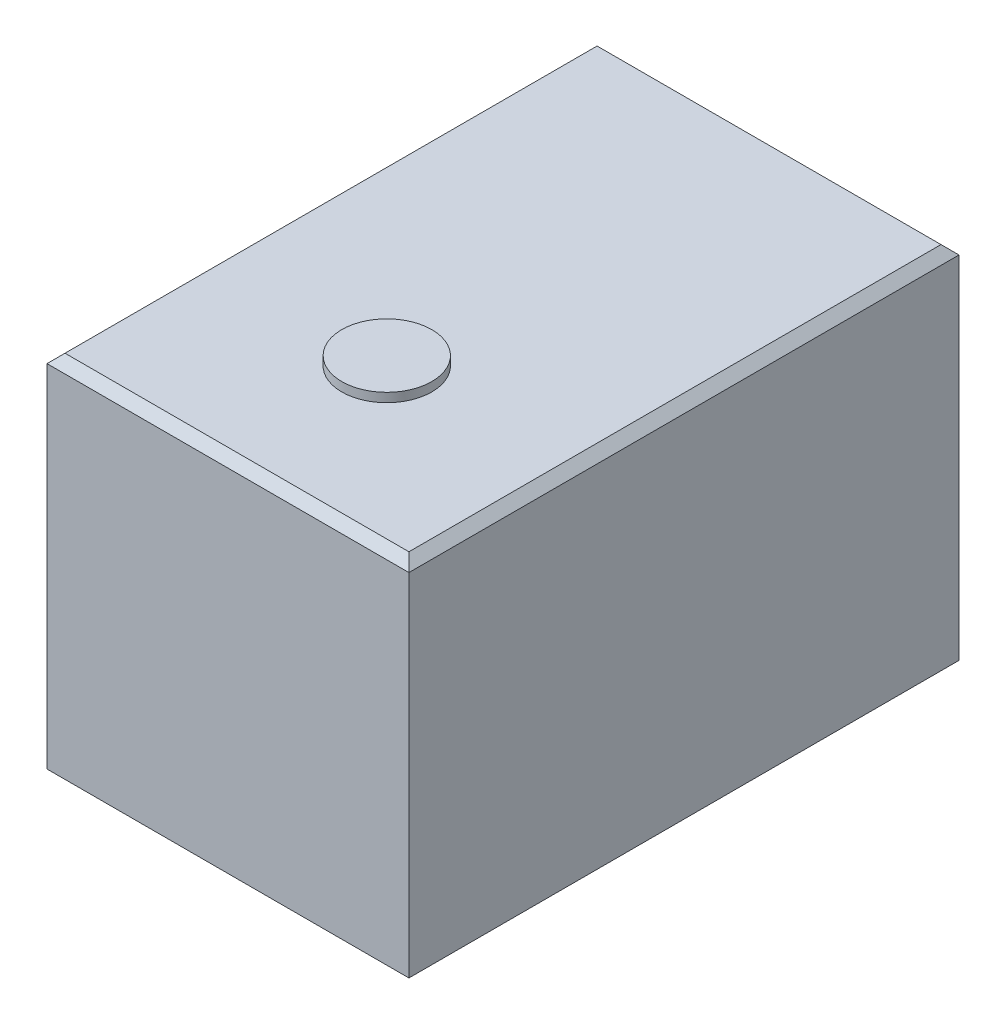
ISO-10303-21;
HEADER;
FILE_DESCRIPTION(('STEP AP214'),'2;1');
FILE_NAME('part.step','',(''),(''),'','','');
FILE_SCHEMA(('AUTOMOTIVE_DESIGN { 1 0 10303 214 1 1 1 1 }'));
ENDSEC;
DATA;
#1=APPLICATION_CONTEXT('core data for automotive mechanical design processes');
#2=APPLICATION_PROTOCOL_DEFINITION('international standard','automotive_design',2000,#1);
#3=PRODUCT_CONTEXT('',#1,'mechanical');
#4=PRODUCT('Part','Part','',(#3));
#5=PRODUCT_RELATED_PRODUCT_CATEGORY('part','',(#4));
#6=PRODUCT_DEFINITION_FORMATION('','',#4);
#7=PRODUCT_DEFINITION_CONTEXT('part definition',#1,'design');
#8=PRODUCT_DEFINITION('design','',#6,#7);
#9=PRODUCT_DEFINITION_SHAPE('','',#8);
#10=(LENGTH_UNIT() NAMED_UNIT(*) SI_UNIT(.MILLI.,.METRE.));
#11=(NAMED_UNIT(*) PLANE_ANGLE_UNIT() SI_UNIT($,.RADIAN.));
#12=(NAMED_UNIT(*) SI_UNIT($,.STERADIAN.) SOLID_ANGLE_UNIT());
#13=UNCERTAINTY_MEASURE_WITH_UNIT(LENGTH_MEASURE(1.E-05),#10,'distance_accuracy_value','');
#14=(GEOMETRIC_REPRESENTATION_CONTEXT(3) GLOBAL_UNCERTAINTY_ASSIGNED_CONTEXT((#13)) GLOBAL_UNIT_ASSIGNED_CONTEXT((#10,
#11,#12)) REPRESENTATION_CONTEXT('',''));
#15=CARTESIAN_POINT('',(0.,0.,0.));
#16=DIRECTION('',(0.,0.,1.));
#17=DIRECTION('',(1.,0.,0.));
#18=AXIS2_PLACEMENT_3D('',#15,#16,#17);
#19=CARTESIAN_POINT('',(0.,41.,-61.1));
#20=DIRECTION('',(1.,0.,0.));
#21=DIRECTION('',(0.,0.,-1.));
#22=AXIS2_PLACEMENT_3D('',#19,#20,#21);
#23=PLANE('',#22);
#24=DIRECTION('',(0.,-1.,0.));
#25=VECTOR('',#24,1.);
#26=CARTESIAN_POINT('',(0.,41.,-61.1));
#27=LINE('',#26,#25);
#28=CARTESIAN_POINT('',(0.,40.,-61.1));
#29=VERTEX_POINT('',#28);
#30=CARTESIAN_POINT('',(0.,1.00000000000001,-61.1));
#31=VERTEX_POINT('',#30);
#32=EDGE_CURVE('E154',#29,#31,#27,.T.);
#33=ORIENTED_EDGE('',*,*,#32,.T.);
#34=DIRECTION('',(0.,0.,1.));
#35=VECTOR('',#34,1.);
#36=CARTESIAN_POINT('',(0.,1.00000000000001,-61.1));
#37=LINE('',#36,#35);
#38=CARTESIAN_POINT('',(0.,1.00000000000001,0.));
#39=VERTEX_POINT('',#38);
#40=EDGE_CURVE('E168',#31,#39,#37,.T.);
#41=ORIENTED_EDGE('',*,*,#40,.T.);
#42=DIRECTION('',(0.,-1.,0.));
#43=VECTOR('',#42,1.);
#44=CARTESIAN_POINT('',(0.,41.,0.));
#45=LINE('',#44,#43);
#46=CARTESIAN_POINT('',(0.,40.,0.));
#47=VERTEX_POINT('',#46);
#48=EDGE_CURVE('E131',#47,#39,#45,.T.);
#49=ORIENTED_EDGE('',*,*,#48,.F.);
#50=DIRECTION('',(0.,0.,-1.));
#51=VECTOR('',#50,1.);
#52=CARTESIAN_POINT('',(0.,40.,-61.1));
#53=LINE('',#52,#51);
#54=EDGE_CURVE('E146',#47,#29,#53,.T.);
#55=ORIENTED_EDGE('',*,*,#54,.T.);
#56=EDGE_LOOP('',(#33,#41,#49,#55));
#57=FACE_BOUND('',#56,.T.);
#58=ADVANCED_FACE('F41',(#57),#23,.F.);
#59=CARTESIAN_POINT('',(0.,41.,0.));
#60=DIRECTION('',(0.,0.,-1.));
#61=DIRECTION('',(-1.,0.,0.));
#62=AXIS2_PLACEMENT_3D('',#59,#60,#61);
#63=PLANE('',#62);
#64=ORIENTED_EDGE('',*,*,#48,.T.);
#65=DIRECTION('',(1.,0.,0.));
#66=VECTOR('',#65,1.);
#67=CARTESIAN_POINT('',(0.,1.00000000000001,0.));
#68=LINE('',#67,#66);
#69=CARTESIAN_POINT('',(40.2,1.00000000000001,0.));
#70=VERTEX_POINT('',#69);
#71=EDGE_CURVE('E147',#39,#70,#68,.T.);
#72=ORIENTED_EDGE('',*,*,#71,.T.);
#73=DIRECTION('',(0.,-1.,0.));
#74=VECTOR('',#73,1.);
#75=CARTESIAN_POINT('',(40.2,41.,0.));
#76=LINE('',#75,#74);
#77=CARTESIAN_POINT('',(40.2,40.,0.));
#78=VERTEX_POINT('',#77);
#79=EDGE_CURVE('E205',#78,#70,#76,.T.);
#80=ORIENTED_EDGE('',*,*,#79,.F.);
#81=DIRECTION('',(-1.,0.,0.));
#82=VECTOR('',#81,1.);
#83=CARTESIAN_POINT('',(0.,40.,0.));
#84=LINE('',#83,#82);
#85=EDGE_CURVE('E144',#78,#47,#84,.T.);
#86=ORIENTED_EDGE('',*,*,#85,.T.);
#87=EDGE_LOOP('',(#64,#72,#80,#86));
#88=FACE_BOUND('',#87,.T.);
#89=ADVANCED_FACE('F204',(#88),#63,.F.);
#90=CARTESIAN_POINT('',(40.2,41.,0.));
#91=DIRECTION('',(-1.,0.,0.));
#92=DIRECTION('',(0.,0.,1.));
#93=AXIS2_PLACEMENT_3D('',#90,#91,#92);
#94=PLANE('',#93);
#95=ORIENTED_EDGE('',*,*,#79,.T.);
#96=DIRECTION('',(0.,0.,-1.));
#97=VECTOR('',#96,1.);
#98=CARTESIAN_POINT('',(40.2,1.00000000000001,0.));
#99=LINE('',#98,#97);
#100=CARTESIAN_POINT('',(40.2,1.00000000000001,-61.1));
#101=VERTEX_POINT('',#100);
#102=EDGE_CURVE('E65',#70,#101,#99,.T.);
#103=ORIENTED_EDGE('',*,*,#102,.T.);
#104=DIRECTION('',(0.,-1.,0.));
#105=VECTOR('',#104,1.);
#106=CARTESIAN_POINT('',(40.2,41.,-61.1));
#107=LINE('',#106,#105);
#108=CARTESIAN_POINT('',(40.2,40.,-61.1));
#109=VERTEX_POINT('',#108);
#110=EDGE_CURVE('E210',#109,#101,#107,.T.);
#111=ORIENTED_EDGE('',*,*,#110,.F.);
#112=DIRECTION('',(0.,0.,1.));
#113=VECTOR('',#112,1.);
#114=CARTESIAN_POINT('',(40.2,40.,0.));
#115=LINE('',#114,#113);
#116=EDGE_CURVE('E138',#109,#78,#115,.T.);
#117=ORIENTED_EDGE('',*,*,#116,.T.);
#118=EDGE_LOOP('',(#95,#103,#111,#117));
#119=FACE_BOUND('',#118,.T.);
#120=ADVANCED_FACE('F208',(#119),#94,.F.);
#121=CARTESIAN_POINT('',(40.2,41.,-61.1));
#122=DIRECTION('',(0.,0.,1.));
#123=DIRECTION('',(1.,0.,0.));
#124=AXIS2_PLACEMENT_3D('',#121,#122,#123);
#125=PLANE('',#124);
#126=ORIENTED_EDGE('',*,*,#110,.T.);
#127=DIRECTION('',(-1.,0.,0.));
#128=VECTOR('',#127,1.);
#129=CARTESIAN_POINT('',(40.2,1.00000000000001,-61.1));
#130=LINE('',#129,#128);
#131=EDGE_CURVE('E57',#101,#31,#130,.T.);
#132=ORIENTED_EDGE('',*,*,#131,.T.);
#133=ORIENTED_EDGE('',*,*,#32,.F.);
#134=DIRECTION('',(1.,0.,0.));
#135=VECTOR('',#134,1.);
#136=CARTESIAN_POINT('',(40.2,40.,-61.1));
#137=LINE('',#136,#135);
#138=EDGE_CURVE('E117',#29,#109,#137,.T.);
#139=ORIENTED_EDGE('',*,*,#138,.T.);
#140=EDGE_LOOP('',(#126,#132,#133,#139));
#141=FACE_BOUND('',#140,.T.);
#142=ADVANCED_FACE('F219',(#141),#125,.F.);
#143=CARTESIAN_POINT('',(0.,41.,0.));
#144=DIRECTION('',(0.,1.,0.));
#145=DIRECTION('',(0.,0.,1.));
#146=AXIS2_PLACEMENT_3D('',#143,#144,#145);
#147=PLANE('',#146);
#148=CARTESIAN_POINT('',(20.1,41.,-17.6409726784528));
#149=DIRECTION('',(0.,1.,0.));
#150=DIRECTION('',(0.,0.,1.));
#151=AXIS2_PLACEMENT_3D('',#148,#149,#150);
#152=CIRCLE('',#151,5.);
#153=CARTESIAN_POINT('',(20.1,41.,-12.6409726784528));
#154=VERTEX_POINT('',#153);
#155=EDGE_CURVE('E11',#154,#154,#152,.T.);
#156=ORIENTED_EDGE('',*,*,#155,.F.);
#157=EDGE_LOOP('',(#156));
#158=FACE_BOUND('',#157,.T.);
#159=DIRECTION('',(0.,0.,-1.));
#160=VECTOR('',#159,1.);
#161=CARTESIAN_POINT('',(39.2,41.,-61.1));
#162=LINE('',#161,#160);
#163=CARTESIAN_POINT('',(39.2,41.,-1.00000000000001));
#164=VERTEX_POINT('',#163);
#165=CARTESIAN_POINT('',(39.2,41.,-60.1));
#166=VERTEX_POINT('',#165);
#167=EDGE_CURVE('E135',#164,#166,#162,.T.);
#168=ORIENTED_EDGE('',*,*,#167,.T.);
#169=DIRECTION('',(-1.,0.,0.));
#170=VECTOR('',#169,1.);
#171=CARTESIAN_POINT('',(0.,41.,-60.1));
#172=LINE('',#171,#170);
#173=CARTESIAN_POINT('',(1.00000000000001,41.,-60.1));
#174=VERTEX_POINT('',#173);
#175=EDGE_CURVE('E115',#166,#174,#172,.T.);
#176=ORIENTED_EDGE('',*,*,#175,.T.);
#177=DIRECTION('',(0.,0.,1.));
#178=VECTOR('',#177,1.);
#179=CARTESIAN_POINT('',(1.00000000000001,41.,0.));
#180=LINE('',#179,#178);
#181=CARTESIAN_POINT('',(1.00000000000001,41.,-1.00000000000001));
#182=VERTEX_POINT('',#181);
#183=EDGE_CURVE('E124',#174,#182,#180,.T.);
#184=ORIENTED_EDGE('',*,*,#183,.T.);
#185=DIRECTION('',(1.,0.,0.));
#186=VECTOR('',#185,1.);
#187=CARTESIAN_POINT('',(40.2,41.,-1.00000000000001));
#188=LINE('',#187,#186);
#189=EDGE_CURVE('E130',#182,#164,#188,.T.);
#190=ORIENTED_EDGE('',*,*,#189,.T.);
#191=EDGE_LOOP('',(#168,#176,#184,#190));
#192=FACE_BOUND('',#191,.T.);
#193=ADVANCED_FACE('F133',(#158,#192),#147,.T.);
#194=CARTESIAN_POINT('',(0.,0.,0.));
#195=DIRECTION('',(0.,1.,0.));
#196=DIRECTION('',(0.,0.,1.));
#197=AXIS2_PLACEMENT_3D('',#194,#195,#196);
#198=PLANE('',#197);
#199=CARTESIAN_POINT('',(20.1,0.,-17.6409726784528));
#200=DIRECTION('',(0.,1.,0.));
#201=DIRECTION('',(0.,0.,1.));
#202=AXIS2_PLACEMENT_3D('',#199,#200,#201);
#203=CIRCLE('',#202,5.);
#204=CARTESIAN_POINT('',(20.1,0.,-12.6409726784528));
#205=VERTEX_POINT('',#204);
#206=EDGE_CURVE('E50',#205,#205,#203,.F.);
#207=ORIENTED_EDGE('',*,*,#206,.F.);
#208=EDGE_LOOP('',(#207));
#209=FACE_BOUND('',#208,.T.);
#210=DIRECTION('',(0.,0.,1.));
#211=VECTOR('',#210,1.);
#212=CARTESIAN_POINT('',(39.2,0.,0.));
#213=LINE('',#212,#211);
#214=CARTESIAN_POINT('',(39.2,0.,-60.1));
#215=VERTEX_POINT('',#214);
#216=CARTESIAN_POINT('',(39.2,0.,-1.00000000000001));
#217=VERTEX_POINT('',#216);
#218=EDGE_CURVE('E161',#215,#217,#213,.T.);
#219=ORIENTED_EDGE('',*,*,#218,.T.);
#220=DIRECTION('',(-1.,0.,0.));
#221=VECTOR('',#220,1.);
#222=CARTESIAN_POINT('',(0.,0.,-1.00000000000001));
#223=LINE('',#222,#221);
#224=CARTESIAN_POINT('',(1.00000000000001,0.,-1.00000000000001));
#225=VERTEX_POINT('',#224);
#226=EDGE_CURVE('E163',#217,#225,#223,.T.);
#227=ORIENTED_EDGE('',*,*,#226,.T.);
#228=DIRECTION('',(0.,0.,-1.));
#229=VECTOR('',#228,1.);
#230=CARTESIAN_POINT('',(1.00000000000001,0.,0.));
#231=LINE('',#230,#229);
#232=CARTESIAN_POINT('',(1.00000000000001,0.,-60.1));
#233=VERTEX_POINT('',#232);
#234=EDGE_CURVE('E157',#225,#233,#231,.T.);
#235=ORIENTED_EDGE('',*,*,#234,.T.);
#236=DIRECTION('',(1.,0.,0.));
#237=VECTOR('',#236,1.);
#238=CARTESIAN_POINT('',(0.,0.,-60.1));
#239=LINE('',#238,#237);
#240=EDGE_CURVE('E159',#233,#215,#239,.T.);
#241=ORIENTED_EDGE('',*,*,#240,.T.);
#242=EDGE_LOOP('',(#219,#227,#235,#241));
#243=FACE_BOUND('',#242,.T.);
#244=ADVANCED_FACE('F184',(#209,#243),#198,.F.);
#245=CARTESIAN_POINT('',(0.,41.,-1.00000000000001));
#246=DIRECTION('',(0.,0.707106781186547,0.707106781186547));
#247=DIRECTION('',(-1.,0.,0.));
#248=AXIS2_PLACEMENT_3D('',#245,#246,#247);
#249=PLANE('',#248);
#250=DIRECTION('',(0.577350269189626,0.577350269189626,-0.577350269189626));
#251=VECTOR('',#250,1.);
#252=CARTESIAN_POINT('',(0.666666666666672,40.6666666666667,-0.666666666666672));
#253=LINE('',#252,#251);
#254=EDGE_CURVE('E127',#47,#182,#253,.T.);
#255=ORIENTED_EDGE('',*,*,#254,.F.);
#256=ORIENTED_EDGE('',*,*,#85,.F.);
#257=DIRECTION('',(-0.577350269189626,0.577350269189626,-0.577350269189626));
#258=VECTOR('',#257,1.);
#259=CARTESIAN_POINT('',(26.1333333333333,54.0666666666667,-14.0666666666667));
#260=LINE('',#259,#258);
#261=EDGE_CURVE('E151',#164,#78,#260,.F.);
#262=ORIENTED_EDGE('',*,*,#261,.F.);
#263=ORIENTED_EDGE('',*,*,#189,.F.);
#264=EDGE_LOOP('',(#255,#256,#262,#263));
#265=FACE_BOUND('',#264,.T.);
#266=ADVANCED_FACE('F187',(#265),#249,.T.);
#267=CARTESIAN_POINT('',(39.2,41.,0.));
#268=DIRECTION('',(0.707106781186547,0.707106781186547,0.));
#269=DIRECTION('',(0.,0.,1.));
#270=AXIS2_PLACEMENT_3D('',#267,#268,#269);
#271=PLANE('',#270);
#272=ORIENTED_EDGE('',*,*,#261,.T.);
#273=ORIENTED_EDGE('',*,*,#116,.F.);
#274=DIRECTION('',(-0.577350269189626,0.577350269189626,0.577350269189626));
#275=VECTOR('',#274,1.);
#276=CARTESIAN_POINT('',(19.1666666666667,61.0333333333333,-40.0666666666667));
#277=LINE('',#276,#275);
#278=EDGE_CURVE('E120',#166,#109,#277,.F.);
#279=ORIENTED_EDGE('',*,*,#278,.F.);
#280=ORIENTED_EDGE('',*,*,#167,.F.);
#281=EDGE_LOOP('',(#272,#273,#279,#280));
#282=FACE_BOUND('',#281,.T.);
#283=ADVANCED_FACE('F218',(#282),#271,.T.);
#284=CARTESIAN_POINT('',(1.00000000000001,41.,0.));
#285=DIRECTION('',(-0.707106781186547,0.707106781186547,0.));
#286=DIRECTION('',(0.,0.,-1.));
#287=AXIS2_PLACEMENT_3D('',#284,#285,#286);
#288=PLANE('',#287);
#289=ORIENTED_EDGE('',*,*,#254,.T.);
#290=ORIENTED_EDGE('',*,*,#183,.F.);
#291=DIRECTION('',(-0.577350269189626,-0.577350269189626,-0.577350269189626));
#292=VECTOR('',#291,1.);
#293=CARTESIAN_POINT('',(21.0333333333333,61.0333333333333,-40.0666666666667));
#294=LINE('',#293,#292);
#295=EDGE_CURVE('E111',#29,#174,#294,.F.);
#296=ORIENTED_EDGE('',*,*,#295,.F.);
#297=ORIENTED_EDGE('',*,*,#54,.F.);
#298=EDGE_LOOP('',(#289,#290,#296,#297));
#299=FACE_BOUND('',#298,.T.);
#300=ADVANCED_FACE('F125',(#299),#288,.T.);
#301=CARTESIAN_POINT('',(0.,41.,-60.1));
#302=DIRECTION('',(0.,0.707106781186547,-0.707106781186547));
#303=DIRECTION('',(1.,0.,0.));
#304=AXIS2_PLACEMENT_3D('',#301,#302,#303);
#305=PLANE('',#304);
#306=ORIENTED_EDGE('',*,*,#278,.T.);
#307=ORIENTED_EDGE('',*,*,#138,.F.);
#308=ORIENTED_EDGE('',*,*,#295,.T.);
#309=ORIENTED_EDGE('',*,*,#175,.F.);
#310=EDGE_LOOP('',(#306,#307,#308,#309));
#311=FACE_BOUND('',#310,.T.);
#312=ADVANCED_FACE('F113',(#311),#305,.T.);
#313=CARTESIAN_POINT('',(40.2,1.00000000000001,-61.1));
#314=DIRECTION('',(0.,0.707106781186547,0.707106781186547));
#315=DIRECTION('',(-1.,0.,0.));
#316=AXIS2_PLACEMENT_3D('',#313,#314,#315);
#317=PLANE('',#316);
#318=DIRECTION('',(-0.577350269189626,-0.577350269189626,0.577350269189626));
#319=VECTOR('',#318,1.);
#320=CARTESIAN_POINT('',(40.2,1.00000000000001,-61.1));
#321=LINE('',#320,#319);
#322=EDGE_CURVE('E175',#215,#101,#321,.F.);
#323=ORIENTED_EDGE('',*,*,#322,.F.);
#324=ORIENTED_EDGE('',*,*,#240,.F.);
#325=DIRECTION('',(0.577350269189626,-0.577350269189626,0.577350269189626));
#326=VECTOR('',#325,1.);
#327=CARTESIAN_POINT('',(0.,1.00000000000001,-61.1));
#328=LINE('',#327,#326);
#329=EDGE_CURVE('E121',#31,#233,#328,.T.);
#330=ORIENTED_EDGE('',*,*,#329,.F.);
#331=ORIENTED_EDGE('',*,*,#131,.F.);
#332=EDGE_LOOP('',(#323,#324,#330,#331));
#333=FACE_BOUND('',#332,.T.);
#334=ADVANCED_FACE('F44',(#333),#317,.F.);
#335=CARTESIAN_POINT('',(0.,1.00000000000001,-61.1));
#336=DIRECTION('',(0.707106781186547,0.707106781186547,0.));
#337=DIRECTION('',(0.,0.,1.));
#338=AXIS2_PLACEMENT_3D('',#335,#336,#337);
#339=PLANE('',#338);
#340=ORIENTED_EDGE('',*,*,#329,.T.);
#341=ORIENTED_EDGE('',*,*,#234,.F.);
#342=DIRECTION('',(-0.577350269189626,0.577350269189626,0.577350269189626));
#343=VECTOR('',#342,1.);
#344=CARTESIAN_POINT('',(20.3666666666667,-19.3666666666667,-20.3666666666667));
#345=LINE('',#344,#343);
#346=EDGE_CURVE('E172',#39,#225,#345,.F.);
#347=ORIENTED_EDGE('',*,*,#346,.F.);
#348=ORIENTED_EDGE('',*,*,#40,.F.);
#349=EDGE_LOOP('',(#340,#341,#347,#348));
#350=FACE_BOUND('',#349,.T.);
#351=ADVANCED_FACE('F278',(#350),#339,.F.);
#352=CARTESIAN_POINT('',(40.2,1.00000000000001,0.));
#353=DIRECTION('',(-0.707106781186547,0.707106781186547,0.));
#354=DIRECTION('',(0.,0.,-1.));
#355=AXIS2_PLACEMENT_3D('',#352,#353,#354);
#356=PLANE('',#355);
#357=ORIENTED_EDGE('',*,*,#322,.T.);
#358=ORIENTED_EDGE('',*,*,#102,.F.);
#359=DIRECTION('',(-0.577350269189626,-0.577350269189626,-0.577350269189626));
#360=VECTOR('',#359,1.);
#361=CARTESIAN_POINT('',(40.2,1.00000000000001,0.));
#362=LINE('',#361,#360);
#363=EDGE_CURVE('E170',#217,#70,#362,.F.);
#364=ORIENTED_EDGE('',*,*,#363,.F.);
#365=ORIENTED_EDGE('',*,*,#218,.F.);
#366=EDGE_LOOP('',(#357,#358,#364,#365));
#367=FACE_BOUND('',#366,.T.);
#368=ADVANCED_FACE('F200',(#367),#356,.F.);
#369=CARTESIAN_POINT('',(0.,1.00000000000001,0.));
#370=DIRECTION('',(0.,0.707106781186547,-0.707106781186547));
#371=DIRECTION('',(1.,0.,0.));
#372=AXIS2_PLACEMENT_3D('',#369,#370,#371);
#373=PLANE('',#372);
#374=ORIENTED_EDGE('',*,*,#346,.T.);
#375=ORIENTED_EDGE('',*,*,#226,.F.);
#376=ORIENTED_EDGE('',*,*,#363,.T.);
#377=ORIENTED_EDGE('',*,*,#71,.F.);
#378=EDGE_LOOP('',(#374,#375,#376,#377));
#379=FACE_BOUND('',#378,.T.);
#380=ADVANCED_FACE('F196',(#379),#373,.F.);
#381=CARTESIAN_POINT('',(20.1,-1.,-17.6409726784528));
#382=DIRECTION('',(0.,1.,0.));
#383=DIRECTION('',(0.,0.,1.));
#384=AXIS2_PLACEMENT_3D('',#381,#382,#383);
#385=CYLINDRICAL_SURFACE('',#384,5.);
#386=CARTESIAN_POINT('',(20.1,-1.,-17.6409726784528));
#387=DIRECTION('',(0.,-1.,0.));
#388=DIRECTION('',(0.,0.,-1.));
#389=AXIS2_PLACEMENT_3D('',#386,#387,#388);
#390=CIRCLE('',#389,5.);
#391=CARTESIAN_POINT('',(20.1,-1.,-22.6409726784528));
#392=VERTEX_POINT('',#391);
#393=EDGE_CURVE('E173',#392,#392,#390,.T.);
#394=ORIENTED_EDGE('',*,*,#393,.F.);
#395=EDGE_LOOP('',(#394));
#396=FACE_BOUND('',#395,.T.);
#397=ORIENTED_EDGE('',*,*,#206,.T.);
#398=EDGE_LOOP('',(#397));
#399=FACE_BOUND('',#398,.T.);
#400=ADVANCED_FACE('F182',(#396,#399),#385,.T.);
#401=CARTESIAN_POINT('',(20.1,-1.,-17.6409726784528));
#402=DIRECTION('',(0.,-1.,0.));
#403=DIRECTION('',(0.,0.,-1.));
#404=AXIS2_PLACEMENT_3D('',#401,#402,#403);
#405=PLANE('',#404);
#406=ORIENTED_EDGE('',*,*,#393,.T.);
#407=EDGE_LOOP('',(#406));
#408=FACE_BOUND('',#407,.T.);
#409=ADVANCED_FACE('F238',(#408),#405,.T.);
#410=CARTESIAN_POINT('',(20.1,42.,-17.6409726784528));
#411=DIRECTION('',(0.,-1.,0.));
#412=DIRECTION('',(0.,0.,-1.));
#413=AXIS2_PLACEMENT_3D('',#410,#411,#412);
#414=CYLINDRICAL_SURFACE('',#413,5.);
#415=CARTESIAN_POINT('',(20.1,42.,-17.6409726784528));
#416=DIRECTION('',(0.,-1.,0.));
#417=DIRECTION('',(0.,0.,-1.));
#418=AXIS2_PLACEMENT_3D('',#415,#416,#417);
#419=CIRCLE('',#418,5.);
#420=CARTESIAN_POINT('',(20.1,42.,-22.6409726784528));
#421=VERTEX_POINT('',#420);
#422=EDGE_CURVE('E225',#421,#421,#419,.T.);
#423=ORIENTED_EDGE('',*,*,#422,.T.);
#424=EDGE_LOOP('',(#423));
#425=FACE_BOUND('',#424,.T.);
#426=ORIENTED_EDGE('',*,*,#155,.T.);
#427=EDGE_LOOP('',(#426));
#428=FACE_BOUND('',#427,.T.);
#429=ADVANCED_FACE('F229',(#425,#428),#414,.T.);
#430=CARTESIAN_POINT('',(20.1,42.,-17.6409726784528));
#431=DIRECTION('',(0.,1.,0.));
#432=DIRECTION('',(0.,0.,-1.));
#433=AXIS2_PLACEMENT_3D('',#430,#431,#432);
#434=PLANE('',#433);
#435=ORIENTED_EDGE('',*,*,#422,.F.);
#436=EDGE_LOOP('',(#435));
#437=FACE_BOUND('',#436,.T.);
#438=ADVANCED_FACE('F232',(#437),#434,.T.);
#439=CLOSED_SHELL('',(#58,#89,#120,#142,#193,#244,#266,#283,#300,#312,#334,#351,#368,#380,#400,
#409,#429,#438));
#440=MANIFOLD_SOLID_BREP('B2',#439);
#441=ADVANCED_BREP_SHAPE_REPRESENTATION('',(#18,#440),#14);
#442=SHAPE_DEFINITION_REPRESENTATION(#9,#441);
ENDSEC;
END-ISO-10303-21;
